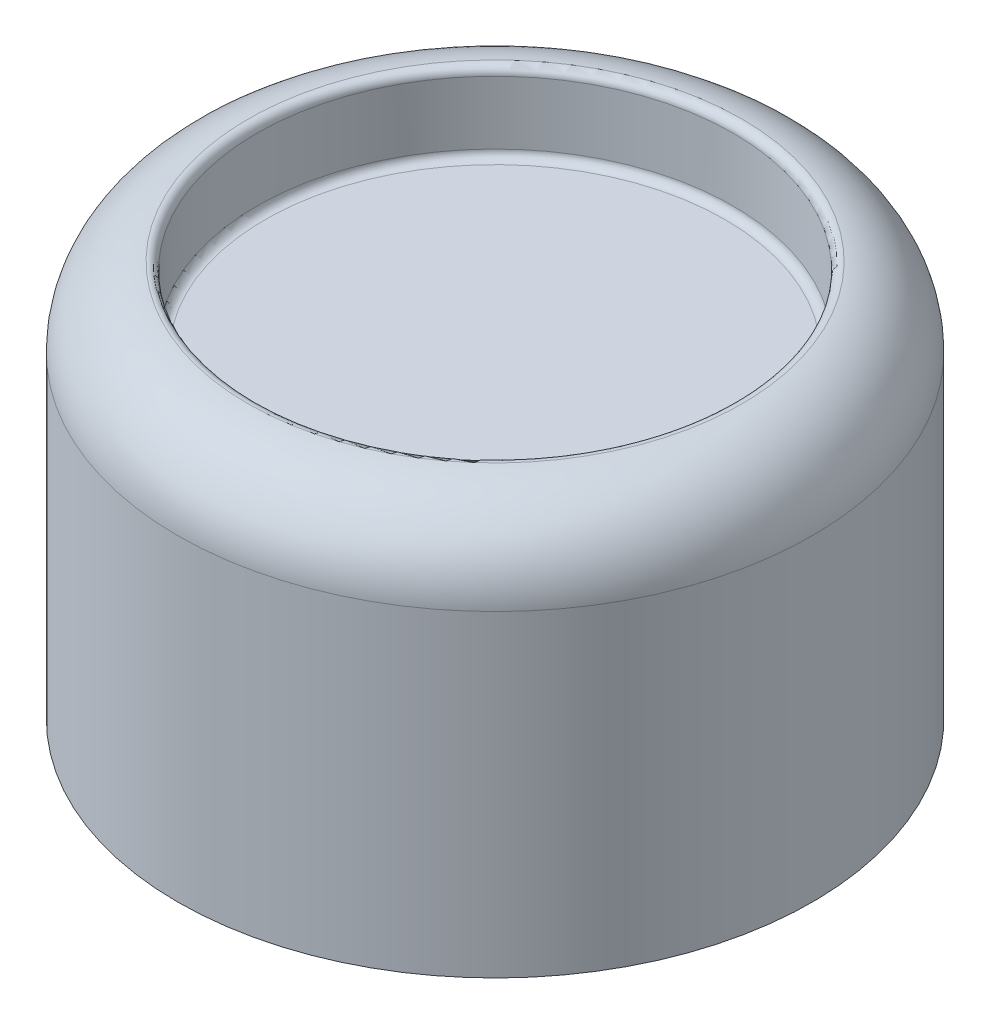
ISO-10303-21;
HEADER;
FILE_DESCRIPTION(('STEP AP214'),'2;1');
FILE_NAME('part.step','',(''),(''),'','','');
FILE_SCHEMA(('AUTOMOTIVE_DESIGN { 1 0 10303 214 1 1 1 1 }'));
ENDSEC;
DATA;
#1=APPLICATION_CONTEXT('core data for automotive mechanical design processes');
#2=APPLICATION_PROTOCOL_DEFINITION('international standard','automotive_design',2000,#1);
#3=PRODUCT_CONTEXT('',#1,'mechanical');
#4=PRODUCT('Part','Part','',(#3));
#5=PRODUCT_RELATED_PRODUCT_CATEGORY('part','',(#4));
#6=PRODUCT_DEFINITION_FORMATION('','',#4);
#7=PRODUCT_DEFINITION_CONTEXT('part definition',#1,'design');
#8=PRODUCT_DEFINITION('design','',#6,#7);
#9=PRODUCT_DEFINITION_SHAPE('','',#8);
#10=(LENGTH_UNIT() NAMED_UNIT(*) SI_UNIT(.MILLI.,.METRE.));
#11=(NAMED_UNIT(*) PLANE_ANGLE_UNIT() SI_UNIT($,.RADIAN.));
#12=(NAMED_UNIT(*) SI_UNIT($,.STERADIAN.) SOLID_ANGLE_UNIT());
#13=UNCERTAINTY_MEASURE_WITH_UNIT(LENGTH_MEASURE(1.E-05),#10,'distance_accuracy_value','');
#14=(GEOMETRIC_REPRESENTATION_CONTEXT(3) GLOBAL_UNCERTAINTY_ASSIGNED_CONTEXT((#13)) GLOBAL_UNIT_ASSIGNED_CONTEXT((#10,
#11,#12)) REPRESENTATION_CONTEXT('',''));
#15=CARTESIAN_POINT('',(0.,0.,0.));
#16=DIRECTION('',(0.,0.,1.));
#17=DIRECTION('',(1.,0.,0.));
#18=AXIS2_PLACEMENT_3D('',#15,#16,#17);
#19=CARTESIAN_POINT('',(0.,5.,0.));
#20=DIRECTION('',(0.,-1.,0.));
#21=DIRECTION('',(0.,0.,-1.));
#22=AXIS2_PLACEMENT_3D('',#19,#20,#21);
#23=CYLINDRICAL_SURFACE('',#22,4.);
#24=CARTESIAN_POINT('',(0.,4.,0.));
#25=DIRECTION('',(0.,1.,0.));
#26=DIRECTION('',(0.,0.,1.));
#27=AXIS2_PLACEMENT_3D('',#24,#25,#26);
#28=CIRCLE('',#27,4.);
#29=CARTESIAN_POINT('',(0.,4.,4.));
#30=VERTEX_POINT('',#29);
#31=EDGE_CURVE('E73',#30,#30,#28,.F.);
#32=ORIENTED_EDGE('',*,*,#31,.T.);
#33=EDGE_LOOP('',(#32));
#34=FACE_BOUND('',#33,.T.);
#35=CARTESIAN_POINT('',(0.,0.,0.));
#36=DIRECTION('',(0.,1.,0.));
#37=DIRECTION('',(0.,0.,1.));
#38=AXIS2_PLACEMENT_3D('',#35,#36,#37);
#39=CIRCLE('',#38,4.);
#40=CARTESIAN_POINT('',(0.,0.,4.));
#41=VERTEX_POINT('',#40);
#42=EDGE_CURVE('E77',#41,#41,#39,.T.);
#43=ORIENTED_EDGE('',*,*,#42,.T.);
#44=EDGE_LOOP('',(#43));
#45=FACE_BOUND('',#44,.T.);
#46=ADVANCED_FACE('F41',(#34,#45),#23,.T.);
#47=CARTESIAN_POINT('',(0.,0.,0.));
#48=DIRECTION('',(0.,1.,0.));
#49=DIRECTION('',(0.,0.,1.));
#50=AXIS2_PLACEMENT_3D('',#47,#48,#49);
#51=PLANE('',#50);
#52=CARTESIAN_POINT('',(0.,0.,0.));
#53=DIRECTION('',(0.,-1.,0.));
#54=DIRECTION('',(0.,0.,-1.));
#55=AXIS2_PLACEMENT_3D('',#52,#53,#54);
#56=CIRCLE('',#55,3.);
#57=CARTESIAN_POINT('',(0.,0.,-3.));
#58=VERTEX_POINT('',#57);
#59=EDGE_CURVE('E82',#58,#58,#56,.T.);
#60=ORIENTED_EDGE('',*,*,#59,.F.);
#61=EDGE_LOOP('',(#60));
#62=FACE_BOUND('',#61,.T.);
#63=ORIENTED_EDGE('',*,*,#42,.F.);
#64=EDGE_LOOP('',(#63));
#65=FACE_BOUND('',#64,.T.);
#66=ADVANCED_FACE('F114',(#62,#65),#51,.F.);
#67=CARTESIAN_POINT('',(0.,4.,0.));
#68=DIRECTION('',(0.,1.,0.));
#69=DIRECTION('',(0.,0.,1.));
#70=AXIS2_PLACEMENT_3D('',#67,#68,#69);
#71=TOROIDAL_SURFACE('',#70,3.,1.);
#72=CARTESIAN_POINT('',(0.,4.99380798999996,0.));
#73=DIRECTION('',(0.,-1.,0.));
#74=DIRECTION('',(0.,0.,-1.));
#75=AXIS2_PLACEMENT_3D('',#72,#73,#74);
#76=CIRCLE('',#75,3.11111111111112);
#77=CARTESIAN_POINT('',(0.,4.99380798999996,-3.11111111111112));
#78=VERTEX_POINT('',#77);
#79=EDGE_CURVE('E54',#78,#78,#76,.T.);
#80=ORIENTED_EDGE('',*,*,#79,.T.);
#81=EDGE_LOOP('',(#80));
#82=FACE_BOUND('',#81,.T.);
#83=ORIENTED_EDGE('',*,*,#31,.F.);
#84=EDGE_LOOP('',(#83));
#85=FACE_BOUND('',#84,.T.);
#86=ADVANCED_FACE('F123',(#82,#85),#71,.T.);
#87=CARTESIAN_POINT('',(0.,4.,0.));
#88=DIRECTION('',(0.,1.,0.));
#89=DIRECTION('',(0.,0.,1.));
#90=AXIS2_PLACEMENT_3D('',#87,#88,#89);
#91=CYLINDRICAL_SURFACE('',#90,3.);
#92=CARTESIAN_POINT('',(0.,4.1,0.));
#93=DIRECTION('',(0.,1.,0.));
#94=DIRECTION('',(0.,0.,1.));
#95=AXIS2_PLACEMENT_3D('',#92,#93,#94);
#96=CIRCLE('',#95,3.);
#97=CARTESIAN_POINT('',(0.,4.1,3.));
#98=VERTEX_POINT('',#97);
#99=EDGE_CURVE('E59',#98,#98,#96,.F.);
#100=ORIENTED_EDGE('',*,*,#99,.T.);
#101=EDGE_LOOP('',(#100));
#102=FACE_BOUND('',#101,.T.);
#103=CARTESIAN_POINT('',(0.,4.89442719099992,0.));
#104=DIRECTION('',(0.,-1.,0.));
#105=DIRECTION('',(0.,0.,-1.));
#106=AXIS2_PLACEMENT_3D('',#103,#104,#105);
#107=CIRCLE('',#106,3.);
#108=CARTESIAN_POINT('',(0.,4.89442719099992,-3.));
#109=VERTEX_POINT('',#108);
#110=EDGE_CURVE('E65',#109,#109,#107,.F.);
#111=ORIENTED_EDGE('',*,*,#110,.T.);
#112=EDGE_LOOP('',(#111));
#113=FACE_BOUND('',#112,.T.);
#114=ADVANCED_FACE('F133',(#102,#113),#91,.F.);
#115=CARTESIAN_POINT('',(0.,4.,0.));
#116=DIRECTION('',(0.,1.,0.));
#117=DIRECTION('',(0.,0.,1.));
#118=AXIS2_PLACEMENT_3D('',#115,#116,#117);
#119=PLANE('',#118);
#120=CARTESIAN_POINT('',(0.,4.,0.));
#121=DIRECTION('',(0.,1.,0.));
#122=DIRECTION('',(0.,0.,1.));
#123=AXIS2_PLACEMENT_3D('',#120,#121,#122);
#124=CIRCLE('',#123,2.9);
#125=CARTESIAN_POINT('',(0.,4.,2.9));
#126=VERTEX_POINT('',#125);
#127=EDGE_CURVE('E69',#126,#126,#124,.T.);
#128=ORIENTED_EDGE('',*,*,#127,.T.);
#129=EDGE_LOOP('',(#128));
#130=FACE_BOUND('',#129,.T.);
#131=ADVANCED_FACE('F138',(#130),#119,.T.);
#132=CARTESIAN_POINT('',(0.,4.1,0.));
#133=DIRECTION('',(0.,1.,0.));
#134=DIRECTION('',(0.,0.,1.));
#135=AXIS2_PLACEMENT_3D('',#132,#133,#134);
#136=TOROIDAL_SURFACE('',#135,2.9,0.1);
#137=ORIENTED_EDGE('',*,*,#99,.F.);
#138=EDGE_LOOP('',(#137));
#139=FACE_BOUND('',#138,.T.);
#140=ORIENTED_EDGE('',*,*,#127,.F.);
#141=EDGE_LOOP('',(#140));
#142=FACE_BOUND('',#141,.T.);
#143=ADVANCED_FACE('F135',(#139,#142),#136,.F.);
#144=CARTESIAN_POINT('',(0.,4.89442719099992,0.));
#145=DIRECTION('',(0.,-1.,0.));
#146=DIRECTION('',(0.,0.,-1.));
#147=AXIS2_PLACEMENT_3D('',#144,#145,#146);
#148=TOROIDAL_SURFACE('',#147,3.1,0.1);
#149=ORIENTED_EDGE('',*,*,#79,.F.);
#150=EDGE_LOOP('',(#149));
#151=FACE_BOUND('',#150,.T.);
#152=ORIENTED_EDGE('',*,*,#110,.F.);
#153=EDGE_LOOP('',(#152));
#154=FACE_BOUND('',#153,.T.);
#155=ADVANCED_FACE('F137',(#151,#154),#148,.T.);
#156=CARTESIAN_POINT('',(0.,3.5,0.));
#157=DIRECTION('',(0.,-1.,0.));
#158=DIRECTION('',(0.,0.,-1.));
#159=AXIS2_PLACEMENT_3D('',#156,#157,#158);
#160=CYLINDRICAL_SURFACE('',#159,3.);
#161=CARTESIAN_POINT('',(0.,3.5,0.));
#162=DIRECTION('',(0.,-1.,0.));
#163=DIRECTION('',(0.,0.,-1.));
#164=AXIS2_PLACEMENT_3D('',#161,#162,#163);
#165=CIRCLE('',#164,3.);
#166=CARTESIAN_POINT('',(0.,3.5,-3.));
#167=VERTEX_POINT('',#166);
#168=EDGE_CURVE('E81',#167,#167,#165,.T.);
#169=CARTESIAN_POINT('',(0.,3.5,-3.));
#170=CARTESIAN_POINT('',(0.,3.46354166666667,-3.));
#171=CARTESIAN_POINT('',(0.,3.42708333333333,-3.));
#172=CARTESIAN_POINT('',(0.,3.35416666666667,-3.));
#173=CARTESIAN_POINT('',(0.,3.31770833333333,-3.));
#174=CARTESIAN_POINT('',(0.,3.24479166666667,-3.));
#175=CARTESIAN_POINT('',(0.,3.20833333333333,-3.));
#176=CARTESIAN_POINT('',(0.,3.13541666666667,-3.));
#177=CARTESIAN_POINT('',(0.,3.09895833333333,-3.));
#178=CARTESIAN_POINT('',(0.,3.02604166666667,-3.));
#179=CARTESIAN_POINT('',(0.,2.98958333333333,-3.));
#180=CARTESIAN_POINT('',(0.,2.91666666666667,-3.));
#181=CARTESIAN_POINT('',(0.,2.88020833333333,-3.));
#182=CARTESIAN_POINT('',(0.,2.80729166666667,-3.));
#183=CARTESIAN_POINT('',(0.,2.77083333333333,-3.));
#184=CARTESIAN_POINT('',(0.,2.69791666666667,-3.));
#185=CARTESIAN_POINT('',(0.,2.66145833333333,-3.));
#186=CARTESIAN_POINT('',(0.,2.58854166666667,-3.));
#187=CARTESIAN_POINT('',(0.,2.55208333333333,-3.));
#188=CARTESIAN_POINT('',(0.,2.47916666666667,-3.));
#189=CARTESIAN_POINT('',(0.,2.44270833333333,-3.));
#190=CARTESIAN_POINT('',(0.,2.36979166666667,-3.));
#191=CARTESIAN_POINT('',(0.,2.33333333333333,-3.));
#192=CARTESIAN_POINT('',(0.,2.26041666666667,-3.));
#193=CARTESIAN_POINT('',(0.,2.22395833333333,-3.));
#194=CARTESIAN_POINT('',(0.,2.15104166666667,-3.));
#195=CARTESIAN_POINT('',(0.,2.11458333333333,-3.));
#196=CARTESIAN_POINT('',(0.,2.04166666666667,-3.));
#197=CARTESIAN_POINT('',(0.,2.00520833333333,-3.));
#198=CARTESIAN_POINT('',(0.,1.93229166666667,-3.));
#199=CARTESIAN_POINT('',(0.,1.89583333333333,-3.));
#200=CARTESIAN_POINT('',(0.,1.82291666666667,-3.));
#201=CARTESIAN_POINT('',(0.,1.78645833333333,-3.));
#202=CARTESIAN_POINT('',(0.,1.71354166666667,-3.));
#203=CARTESIAN_POINT('',(0.,1.67708333333333,-3.));
#204=CARTESIAN_POINT('',(0.,1.60416666666667,-3.));
#205=CARTESIAN_POINT('',(0.,1.56770833333333,-3.));
#206=CARTESIAN_POINT('',(0.,1.49479166666667,-3.));
#207=CARTESIAN_POINT('',(0.,1.45833333333333,-3.));
#208=CARTESIAN_POINT('',(0.,1.38541666666667,-3.));
#209=CARTESIAN_POINT('',(0.,1.34895833333333,-3.));
#210=CARTESIAN_POINT('',(0.,1.27604166666667,-3.));
#211=CARTESIAN_POINT('',(0.,1.23958333333333,-3.));
#212=CARTESIAN_POINT('',(0.,1.16666666666667,-3.));
#213=CARTESIAN_POINT('',(0.,1.13020833333333,-3.));
#214=CARTESIAN_POINT('',(0.,1.05729166666667,-3.));
#215=CARTESIAN_POINT('',(0.,1.02083333333333,-3.));
#216=CARTESIAN_POINT('',(0.,0.947916666666667,-3.));
#217=CARTESIAN_POINT('',(0.,0.911458333333334,-3.));
#218=CARTESIAN_POINT('',(0.,0.838541666666667,-3.));
#219=CARTESIAN_POINT('',(0.,0.802083333333334,-3.));
#220=CARTESIAN_POINT('',(0.,0.729166666666667,-3.));
#221=CARTESIAN_POINT('',(0.,0.692708333333333,-3.));
#222=CARTESIAN_POINT('',(0.,0.619791666666667,-3.));
#223=CARTESIAN_POINT('',(0.,0.583333333333334,-3.));
#224=CARTESIAN_POINT('',(0.,0.510416666666667,-3.));
#225=CARTESIAN_POINT('',(0.,0.473958333333334,-3.));
#226=CARTESIAN_POINT('',(0.,0.401041666666667,-3.));
#227=CARTESIAN_POINT('',(0.,0.364583333333334,-3.));
#228=CARTESIAN_POINT('',(0.,0.291666666666667,-3.));
#229=CARTESIAN_POINT('',(0.,0.255208333333334,-3.));
#230=CARTESIAN_POINT('',(0.,0.182291666666667,-3.));
#231=CARTESIAN_POINT('',(0.,0.145833333333334,-3.));
#232=CARTESIAN_POINT('',(0.,0.0729166666666671,-3.));
#233=CARTESIAN_POINT('',(0.,0.0364583333333337,-3.));
#234=CARTESIAN_POINT('',(0.,0.,-3.));
#235=B_SPLINE_CURVE_WITH_KNOTS('',3,(#169,#170,#171,#172,#173,#174,#175,#176,#177,#178,#179,
#180,#181,#182,#183,#184,#185,#186,#187,#188,#189,#190,#191,#192,#193,#194,#195,#196,#197,#198,
#199,#200,#201,#202,#203,#204,#205,#206,#207,#208,#209,#210,#211,#212,#213,#214,#215,#216,#217,
#218,#219,#220,#221,#222,#223,#224,#225,#226,#227,#228,#229,#230,#231,#232,#233,#234),
.UNSPECIFIED.,.F.,.F.,(4,2,2,2,2,2,2,2,2,2,2,2,2,2,2,2,2,2,2,2,2,2,2,2,2,2,2,2,2,2,2,2,4),(0.,
0.109375,0.21875,0.328125,0.4375,0.546875,0.65625,0.765625,0.874999999999999,0.984375,1.09375,
1.203125,1.3125,1.421875,1.53125,1.640625,1.75,1.859375,1.96875,2.078125,2.1875,2.296875,
2.40625,2.515625,2.625,2.734375,2.84375,2.953125,3.0625,3.171875,3.28125,3.390625,3.5),.UNSPECIFIED.);
#236=EDGE_CURVE('BSEAM141',#167,#58,#235,.T.);
#237=ORIENTED_EDGE('',*,*,#168,.F.);
#238=ORIENTED_EDGE('',*,*,#59,.T.);
#239=ORIENTED_EDGE('',*,*,#236,.T.);
#240=ORIENTED_EDGE('',*,*,#236,.F.);
#241=EDGE_LOOP('',(#237,#239,#238,#240));
#242=FACE_BOUND('',#241,.T.);
#243=ADVANCED_FACE('F141',(#242),#160,.F.);
#244=CARTESIAN_POINT('',(0.,3.5,0.));
#245=DIRECTION('',(0.,-1.,0.));
#246=DIRECTION('',(0.,0.,-1.));
#247=AXIS2_PLACEMENT_3D('',#244,#245,#246);
#248=PLANE('',#247);
#249=CARTESIAN_POINT('',(0.,3.5,0.));
#250=DIRECTION('',(0.,-1.,0.));
#251=DIRECTION('',(0.,0.,-1.));
#252=AXIS2_PLACEMENT_3D('',#249,#250,#251);
#253=CIRCLE('',#252,1.2);
#254=CARTESIAN_POINT('',(0.,3.5,-1.2));
#255=VERTEX_POINT('',#254);
#256=EDGE_CURVE('E86',#255,#255,#253,.T.);
#257=ORIENTED_EDGE('',*,*,#256,.F.);
#258=EDGE_LOOP('',(#257));
#259=FACE_BOUND('',#258,.T.);
#260=ORIENTED_EDGE('',*,*,#168,.T.);
#261=EDGE_LOOP('',(#260));
#262=FACE_BOUND('',#261,.T.);
#263=ADVANCED_FACE('F118',(#259,#262),#248,.T.);
#264=CARTESIAN_POINT('',(0.,3.5,0.));
#265=DIRECTION('',(0.,-1.,0.));
#266=DIRECTION('',(0.,0.,-1.));
#267=AXIS2_PLACEMENT_3D('',#264,#265,#266);
#268=CYLINDRICAL_SURFACE('',#267,1.2);
#269=CARTESIAN_POINT('',(0.,0.5,0.));
#270=DIRECTION('',(0.,1.,0.));
#271=DIRECTION('',(0.,0.,1.));
#272=AXIS2_PLACEMENT_3D('',#269,#270,#271);
#273=CIRCLE('',#272,1.2);
#274=CARTESIAN_POINT('',(0.,0.499999999999999,-1.2));
#275=VERTEX_POINT('',#274);
#276=EDGE_CURVE('E10',#275,#275,#273,.T.);
#277=CARTESIAN_POINT('',(0.,0.499999999999999,-1.2));
#278=CARTESIAN_POINT('',(0.,0.531249999999999,-1.2));
#279=CARTESIAN_POINT('',(0.,0.562499999999999,-1.2));
#280=CARTESIAN_POINT('',(0.,0.624999999999999,-1.2));
#281=CARTESIAN_POINT('',(0.,0.656249999999999,-1.2));
#282=CARTESIAN_POINT('',(0.,0.718749999999999,-1.2));
#283=CARTESIAN_POINT('',(0.,0.749999999999999,-1.2));
#284=CARTESIAN_POINT('',(0.,0.812499999999999,-1.2));
#285=CARTESIAN_POINT('',(0.,0.843749999999999,-1.2));
#286=CARTESIAN_POINT('',(0.,0.906249999999999,-1.2));
#287=CARTESIAN_POINT('',(0.,0.937499999999999,-1.2));
#288=CARTESIAN_POINT('',(0.,0.999999999999999,-1.2));
#289=CARTESIAN_POINT('',(0.,1.03125,-1.2));
#290=CARTESIAN_POINT('',(0.,1.09375,-1.2));
#291=CARTESIAN_POINT('',(0.,1.125,-1.2));
#292=CARTESIAN_POINT('',(0.,1.1875,-1.2));
#293=CARTESIAN_POINT('',(0.,1.21875,-1.2));
#294=CARTESIAN_POINT('',(0.,1.28125,-1.2));
#295=CARTESIAN_POINT('',(0.,1.3125,-1.2));
#296=CARTESIAN_POINT('',(0.,1.375,-1.2));
#297=CARTESIAN_POINT('',(0.,1.40625,-1.2));
#298=CARTESIAN_POINT('',(0.,1.46875,-1.2));
#299=CARTESIAN_POINT('',(0.,1.5,-1.2));
#300=CARTESIAN_POINT('',(0.,1.5625,-1.2));
#301=CARTESIAN_POINT('',(0.,1.59375,-1.2));
#302=CARTESIAN_POINT('',(0.,1.65625,-1.2));
#303=CARTESIAN_POINT('',(0.,1.6875,-1.2));
#304=CARTESIAN_POINT('',(0.,1.75,-1.2));
#305=CARTESIAN_POINT('',(0.,1.78125,-1.2));
#306=CARTESIAN_POINT('',(0.,1.84375,-1.2));
#307=CARTESIAN_POINT('',(0.,1.875,-1.2));
#308=CARTESIAN_POINT('',(0.,1.9375,-1.2));
#309=CARTESIAN_POINT('',(0.,1.96875,-1.2));
#310=CARTESIAN_POINT('',(0.,2.03125,-1.2));
#311=CARTESIAN_POINT('',(0.,2.0625,-1.2));
#312=CARTESIAN_POINT('',(0.,2.125,-1.2));
#313=CARTESIAN_POINT('',(0.,2.15625,-1.2));
#314=CARTESIAN_POINT('',(0.,2.21875,-1.2));
#315=CARTESIAN_POINT('',(0.,2.25,-1.2));
#316=CARTESIAN_POINT('',(0.,2.3125,-1.2));
#317=CARTESIAN_POINT('',(0.,2.34375,-1.2));
#318=CARTESIAN_POINT('',(0.,2.40625,-1.2));
#319=CARTESIAN_POINT('',(0.,2.4375,-1.2));
#320=CARTESIAN_POINT('',(0.,2.5,-1.2));
#321=CARTESIAN_POINT('',(0.,2.53125,-1.2));
#322=CARTESIAN_POINT('',(0.,2.59375,-1.2));
#323=CARTESIAN_POINT('',(0.,2.625,-1.2));
#324=CARTESIAN_POINT('',(0.,2.6875,-1.2));
#325=CARTESIAN_POINT('',(0.,2.71875,-1.2));
#326=CARTESIAN_POINT('',(0.,2.78125,-1.2));
#327=CARTESIAN_POINT('',(0.,2.8125,-1.2));
#328=CARTESIAN_POINT('',(0.,2.875,-1.2));
#329=CARTESIAN_POINT('',(0.,2.90625,-1.2));
#330=CARTESIAN_POINT('',(0.,2.96875,-1.2));
#331=CARTESIAN_POINT('',(0.,3.,-1.2));
#332=CARTESIAN_POINT('',(0.,3.0625,-1.2));
#333=CARTESIAN_POINT('',(0.,3.09375,-1.2));
#334=CARTESIAN_POINT('',(0.,3.15625,-1.2));
#335=CARTESIAN_POINT('',(0.,3.1875,-1.2));
#336=CARTESIAN_POINT('',(0.,3.25,-1.2));
#337=CARTESIAN_POINT('',(0.,3.28125,-1.2));
#338=CARTESIAN_POINT('',(0.,3.34375,-1.2));
#339=CARTESIAN_POINT('',(0.,3.375,-1.2));
#340=CARTESIAN_POINT('',(0.,3.4375,-1.2));
#341=CARTESIAN_POINT('',(0.,3.46875,-1.2));
#342=CARTESIAN_POINT('',(0.,3.5,-1.2));
#343=B_SPLINE_CURVE_WITH_KNOTS('',3,(#277,#278,#279,#280,#281,#282,#283,#284,#285,#286,#287,
#288,#289,#290,#291,#292,#293,#294,#295,#296,#297,#298,#299,#300,#301,#302,#303,#304,#305,#306,
#307,#308,#309,#310,#311,#312,#313,#314,#315,#316,#317,#318,#319,#320,#321,#322,#323,#324,#325,
#326,#327,#328,#329,#330,#331,#332,#333,#334,#335,#336,#337,#338,#339,#340,#341,#342),
.UNSPECIFIED.,.F.,.F.,(4,2,2,2,2,2,2,2,2,2,2,2,2,2,2,2,2,2,2,2,2,2,2,2,2,2,2,2,2,2,2,2,4),(0.,
0.0937500000000001,0.1875,0.28125,0.375,0.46875,0.5625,0.65625,0.75,0.84375,0.9375,1.03125,
1.125,1.21875,1.3125,1.40625,1.5,1.59375,1.6875,1.78125,1.875,1.96875,2.0625,2.15625,2.25,
2.34375,2.4375,2.53125,2.625,2.71875,2.8125,2.90625,3.),.UNSPECIFIED.);
#344=EDGE_CURVE('BSEAM112',#275,#255,#343,.T.);
#345=ORIENTED_EDGE('',*,*,#276,.T.);
#346=ORIENTED_EDGE('',*,*,#256,.T.);
#347=ORIENTED_EDGE('',*,*,#344,.T.);
#348=ORIENTED_EDGE('',*,*,#344,.F.);
#349=EDGE_LOOP('',(#345,#347,#346,#348));
#350=FACE_BOUND('',#349,.T.);
#351=ADVANCED_FACE('F112',(#350),#268,.T.);
#352=CARTESIAN_POINT('',(0.,0.,0.));
#353=DIRECTION('',(0.,1.,0.));
#354=DIRECTION('',(0.,0.,1.));
#355=AXIS2_PLACEMENT_3D('',#352,#353,#354);
#356=CIRCLE('',#355,0.7);
#357=CARTESIAN_POINT('',(0.,0.,0.7));
#358=VERTEX_POINT('',#357);
#359=EDGE_CURVE('E49',#358,#358,#356,.F.);
#360=ORIENTED_EDGE('',*,*,#359,.T.);
#361=EDGE_LOOP('',(#360));
#362=FACE_BOUND('',#361,.T.);
#363=CARTESIAN_POINT('',(0.,0.,0.));
#364=DIRECTION('',(0.,-1.,0.));
#365=DIRECTION('',(0.,0.,-1.));
#366=AXIS2_PLACEMENT_3D('',#363,#364,#365);
#367=CIRCLE('',#366,0.5);
#368=CARTESIAN_POINT('',(0.,0.,-0.5));
#369=VERTEX_POINT('',#368);
#370=EDGE_CURVE('E94',#369,#369,#367,.T.);
#371=ORIENTED_EDGE('',*,*,#370,.F.);
#372=EDGE_LOOP('',(#371));
#373=FACE_BOUND('',#372,.T.);
#374=ADVANCED_FACE('F107',(#362,#373),#51,.F.);
#375=CARTESIAN_POINT('',(0.,3.5,0.));
#376=DIRECTION('',(0.,-1.,0.));
#377=DIRECTION('',(0.,0.,-1.));
#378=AXIS2_PLACEMENT_3D('',#375,#376,#377);
#379=CYLINDRICAL_SURFACE('',#378,0.5);
#380=CARTESIAN_POINT('',(0.,3.5,0.));
#381=DIRECTION('',(0.,-1.,0.));
#382=DIRECTION('',(0.,0.,-1.));
#383=AXIS2_PLACEMENT_3D('',#380,#381,#382);
#384=CIRCLE('',#383,0.5);
#385=CARTESIAN_POINT('',(0.,3.5,-0.5));
#386=VERTEX_POINT('',#385);
#387=EDGE_CURVE('E93',#386,#386,#384,.T.);
#388=ORIENTED_EDGE('',*,*,#387,.F.);
#389=EDGE_LOOP('',(#388));
#390=FACE_BOUND('',#389,.T.);
#391=ORIENTED_EDGE('',*,*,#370,.T.);
#392=EDGE_LOOP('',(#391));
#393=FACE_BOUND('',#392,.T.);
#394=ADVANCED_FACE('F104',(#390,#393),#379,.F.);
#395=CARTESIAN_POINT('',(0.,3.5,0.));
#396=DIRECTION('',(0.,-1.,0.));
#397=DIRECTION('',(0.,0.,-1.));
#398=AXIS2_PLACEMENT_3D('',#395,#396,#397);
#399=PLANE('',#398);
#400=ORIENTED_EDGE('',*,*,#387,.T.);
#401=EDGE_LOOP('',(#400));
#402=FACE_BOUND('',#401,.T.);
#403=ADVANCED_FACE('F102',(#402),#399,.T.);
#404=CARTESIAN_POINT('',(0.,0.5,0.));
#405=DIRECTION('',(0.,1.,0.));
#406=DIRECTION('',(0.,0.,1.));
#407=AXIS2_PLACEMENT_3D('',#404,#405,#406);
#408=TOROIDAL_SURFACE('',#407,0.7,0.5);
#409=ORIENTED_EDGE('',*,*,#276,.F.);
#410=EDGE_LOOP('',(#409));
#411=FACE_BOUND('',#410,.T.);
#412=ORIENTED_EDGE('',*,*,#359,.F.);
#413=EDGE_LOOP('',(#412));
#414=FACE_BOUND('',#413,.T.);
#415=ADVANCED_FACE('F43',(#411,#414),#408,.T.);
#416=CLOSED_SHELL('',(#46,#66,#86,#114,#131,#143,#155,#243,#263,#351,#374,#394,#403,#415));
#417=MANIFOLD_SOLID_BREP('B2',#416);
#418=ADVANCED_BREP_SHAPE_REPRESENTATION('',(#18,#417),#14);
#419=SHAPE_DEFINITION_REPRESENTATION(#9,#418);
ENDSEC;
END-ISO-10303-21;
